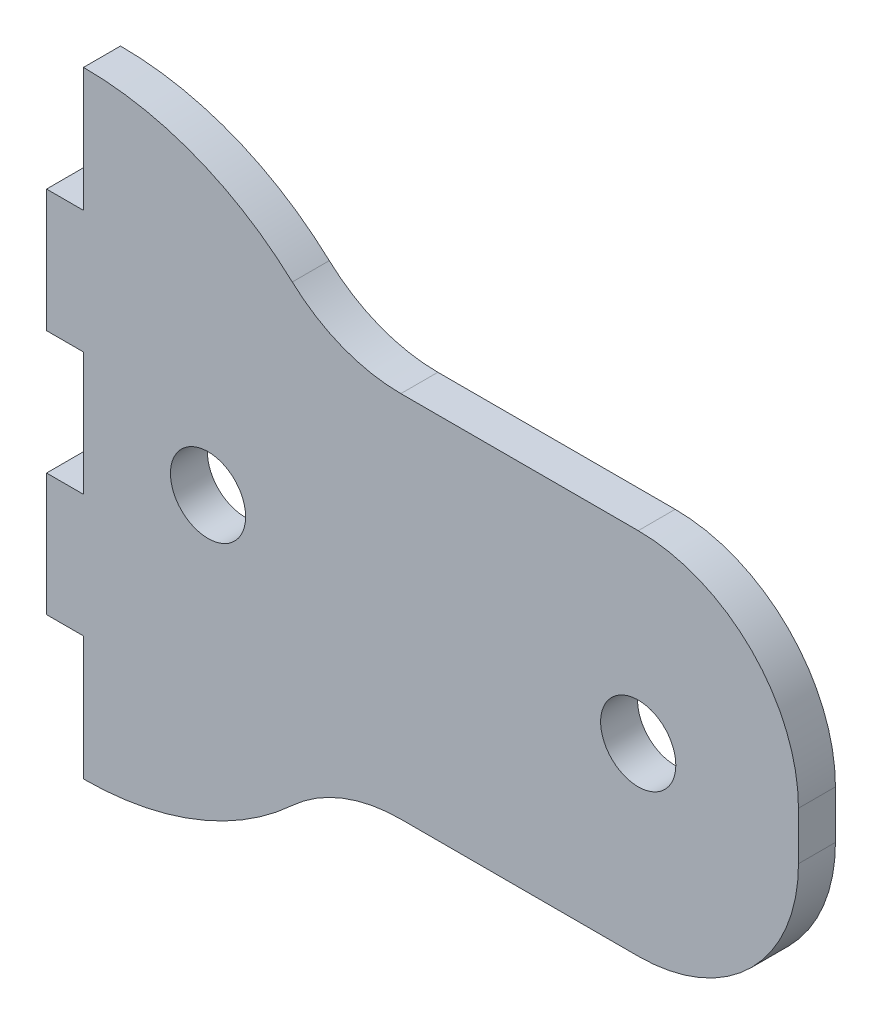
ISO-10303-21;
HEADER;
FILE_DESCRIPTION(('STEP AP214'),'2;1');
FILE_NAME('part.step','',(''),(''),'','','');
FILE_SCHEMA(('AUTOMOTIVE_DESIGN { 1 0 10303 214 1 1 1 1 }'));
ENDSEC;
DATA;
#1=APPLICATION_CONTEXT('core data for automotive mechanical design processes');
#2=APPLICATION_PROTOCOL_DEFINITION('international standard','automotive_design',2000,#1);
#3=PRODUCT_CONTEXT('',#1,'mechanical');
#4=PRODUCT('Part','Part','',(#3));
#5=PRODUCT_RELATED_PRODUCT_CATEGORY('part','',(#4));
#6=PRODUCT_DEFINITION_FORMATION('','',#4);
#7=PRODUCT_DEFINITION_CONTEXT('part definition',#1,'design');
#8=PRODUCT_DEFINITION('design','',#6,#7);
#9=PRODUCT_DEFINITION_SHAPE('','',#8);
#10=(LENGTH_UNIT() NAMED_UNIT(*) SI_UNIT(.MILLI.,.METRE.));
#11=(NAMED_UNIT(*) PLANE_ANGLE_UNIT() SI_UNIT($,.RADIAN.));
#12=(NAMED_UNIT(*) SI_UNIT($,.STERADIAN.) SOLID_ANGLE_UNIT());
#13=UNCERTAINTY_MEASURE_WITH_UNIT(LENGTH_MEASURE(1.E-05),#10,'distance_accuracy_value','');
#14=(GEOMETRIC_REPRESENTATION_CONTEXT(3) GLOBAL_UNCERTAINTY_ASSIGNED_CONTEXT((#13)) GLOBAL_UNIT_ASSIGNED_CONTEXT((#10,
#11,#12)) REPRESENTATION_CONTEXT('',''));
#15=CARTESIAN_POINT('',(0.,0.,0.));
#16=DIRECTION('',(0.,0.,1.));
#17=DIRECTION('',(1.,0.,0.));
#18=AXIS2_PLACEMENT_3D('',#15,#16,#17);
#19=CARTESIAN_POINT('',(0.,5.,3.));
#20=DIRECTION('',(1.,0.,0.));
#21=DIRECTION('',(0.,0.,-1.));
#22=AXIS2_PLACEMENT_3D('',#19,#20,#21);
#23=PLANE('',#22);
#24=DIRECTION('',(0.,-1.,0.));
#25=VECTOR('',#24,1.);
#26=CARTESIAN_POINT('',(0.,5.,0.));
#27=LINE('',#26,#25);
#28=CARTESIAN_POINT('',(0.,5.,0.));
#29=VERTEX_POINT('',#28);
#30=CARTESIAN_POINT('',(0.,-5.00000000000002,0.));
#31=VERTEX_POINT('',#30);
#32=EDGE_CURVE('E191',#29,#31,#27,.T.);
#33=ORIENTED_EDGE('',*,*,#32,.T.);
#34=DIRECTION('',(0.,0.,-1.));
#35=VECTOR('',#34,1.);
#36=CARTESIAN_POINT('',(0.,-5.00000000000002,3.));
#37=LINE('',#36,#35);
#38=CARTESIAN_POINT('',(0.,-5.00000000000002,3.));
#39=VERTEX_POINT('',#38);
#40=EDGE_CURVE('E11',#39,#31,#37,.T.);
#41=ORIENTED_EDGE('',*,*,#40,.F.);
#42=DIRECTION('',(0.,-1.,0.));
#43=VECTOR('',#42,1.);
#44=CARTESIAN_POINT('',(0.,5.,3.));
#45=LINE('',#44,#43);
#46=CARTESIAN_POINT('',(0.,5.,3.));
#47=VERTEX_POINT('',#46);
#48=EDGE_CURVE('E226',#47,#39,#45,.T.);
#49=ORIENTED_EDGE('',*,*,#48,.F.);
#50=DIRECTION('',(0.,0.,-1.));
#51=VECTOR('',#50,1.);
#52=CARTESIAN_POINT('',(0.,5.,3.));
#53=LINE('',#52,#51);
#54=EDGE_CURVE('E187',#47,#29,#53,.T.);
#55=ORIENTED_EDGE('',*,*,#54,.T.);
#56=EDGE_LOOP('',(#33,#41,#49,#55));
#57=FACE_BOUND('',#56,.T.);
#58=ADVANCED_FACE('F35',(#57),#23,.F.);
#59=CARTESIAN_POINT('',(-3.00000000000001,-5.00000000000002,3.));
#60=DIRECTION('',(0.,-1.,0.));
#61=DIRECTION('',(0.,0.,-1.));
#62=AXIS2_PLACEMENT_3D('',#59,#60,#61);
#63=PLANE('',#62);
#64=DIRECTION('',(-1.,0.,0.));
#65=VECTOR('',#64,1.);
#66=CARTESIAN_POINT('',(-3.00000000000001,-5.00000000000002,0.));
#67=LINE('',#66,#65);
#68=CARTESIAN_POINT('',(-3.00000000000001,-5.00000000000002,0.));
#69=VERTEX_POINT('',#68);
#70=EDGE_CURVE('E194',#31,#69,#67,.T.);
#71=ORIENTED_EDGE('',*,*,#70,.T.);
#72=DIRECTION('',(0.,0.,-1.));
#73=VECTOR('',#72,1.);
#74=CARTESIAN_POINT('',(-3.00000000000001,-5.00000000000002,3.));
#75=LINE('',#74,#73);
#76=CARTESIAN_POINT('',(-3.00000000000001,-5.00000000000002,3.));
#77=VERTEX_POINT('',#76);
#78=EDGE_CURVE('E43',#77,#69,#75,.T.);
#79=ORIENTED_EDGE('',*,*,#78,.F.);
#80=DIRECTION('',(-1.,0.,0.));
#81=VECTOR('',#80,1.);
#82=CARTESIAN_POINT('',(-3.00000000000001,-5.00000000000002,3.));
#83=LINE('',#82,#81);
#84=EDGE_CURVE('E124',#39,#77,#83,.T.);
#85=ORIENTED_EDGE('',*,*,#84,.F.);
#86=ORIENTED_EDGE('',*,*,#40,.T.);
#87=EDGE_LOOP('',(#71,#79,#85,#86));
#88=FACE_BOUND('',#87,.T.);
#89=ADVANCED_FACE('F335',(#88),#63,.F.);
#90=CARTESIAN_POINT('',(-3.,-14.95,3.));
#91=DIRECTION('',(1.,0.,0.));
#92=DIRECTION('',(0.,1.,0.));
#93=AXIS2_PLACEMENT_3D('',#90,#91,#92);
#94=PLANE('',#93);
#95=DIRECTION('',(0.,-1.,0.));
#96=VECTOR('',#95,1.);
#97=CARTESIAN_POINT('',(-3.,-14.95,0.));
#98=LINE('',#97,#96);
#99=CARTESIAN_POINT('',(-3.,-14.95,0.));
#100=VERTEX_POINT('',#99);
#101=EDGE_CURVE('E197',#69,#100,#98,.T.);
#102=ORIENTED_EDGE('',*,*,#101,.T.);
#103=DIRECTION('',(0.,0.,-1.));
#104=VECTOR('',#103,1.);
#105=CARTESIAN_POINT('',(-3.,-14.95,3.));
#106=LINE('',#105,#104);
#107=CARTESIAN_POINT('',(-3.,-14.95,3.));
#108=VERTEX_POINT('',#107);
#109=EDGE_CURVE('E263',#108,#100,#106,.T.);
#110=ORIENTED_EDGE('',*,*,#109,.F.);
#111=DIRECTION('',(0.,-1.,0.));
#112=VECTOR('',#111,1.);
#113=CARTESIAN_POINT('',(-3.,-14.95,3.));
#114=LINE('',#113,#112);
#115=EDGE_CURVE('E271',#77,#108,#114,.T.);
#116=ORIENTED_EDGE('',*,*,#115,.F.);
#117=ORIENTED_EDGE('',*,*,#78,.T.);
#118=EDGE_LOOP('',(#102,#110,#116,#117));
#119=FACE_BOUND('',#118,.T.);
#120=ADVANCED_FACE('F269',(#119),#94,.F.);
#121=CARTESIAN_POINT('',(0.,-14.95,3.));
#122=DIRECTION('',(0.,1.,0.));
#123=DIRECTION('',(0.,0.,1.));
#124=AXIS2_PLACEMENT_3D('',#121,#122,#123);
#125=PLANE('',#124);
#126=DIRECTION('',(1.,0.,0.));
#127=VECTOR('',#126,1.);
#128=CARTESIAN_POINT('',(0.,-14.95,0.));
#129=LINE('',#128,#127);
#130=CARTESIAN_POINT('',(0.,-14.95,0.));
#131=VERTEX_POINT('',#130);
#132=EDGE_CURVE('E199',#100,#131,#129,.T.);
#133=ORIENTED_EDGE('',*,*,#132,.T.);
#134=DIRECTION('',(0.,0.,-1.));
#135=VECTOR('',#134,1.);
#136=CARTESIAN_POINT('',(0.,-14.95,3.));
#137=LINE('',#136,#135);
#138=CARTESIAN_POINT('',(0.,-14.95,3.));
#139=VERTEX_POINT('',#138);
#140=EDGE_CURVE('E260',#139,#131,#137,.T.);
#141=ORIENTED_EDGE('',*,*,#140,.F.);
#142=DIRECTION('',(1.,0.,0.));
#143=VECTOR('',#142,1.);
#144=CARTESIAN_POINT('',(0.,-14.95,3.));
#145=LINE('',#144,#143);
#146=EDGE_CURVE('E289',#108,#139,#145,.T.);
#147=ORIENTED_EDGE('',*,*,#146,.F.);
#148=ORIENTED_EDGE('',*,*,#109,.T.);
#149=EDGE_LOOP('',(#133,#141,#147,#148));
#150=FACE_BOUND('',#149,.T.);
#151=ADVANCED_FACE('F280',(#150),#125,.F.);
#152=CARTESIAN_POINT('',(0.,-25.,3.));
#153=DIRECTION('',(1.,0.,0.));
#154=DIRECTION('',(0.,1.,0.));
#155=AXIS2_PLACEMENT_3D('',#152,#153,#154);
#156=PLANE('',#155);
#157=DIRECTION('',(0.,-1.,0.));
#158=VECTOR('',#157,1.);
#159=CARTESIAN_POINT('',(0.,-25.,0.));
#160=LINE('',#159,#158);
#161=CARTESIAN_POINT('',(0.,-25.,0.));
#162=VERTEX_POINT('',#161);
#163=EDGE_CURVE('E201',#131,#162,#160,.T.);
#164=ORIENTED_EDGE('',*,*,#163,.T.);
#165=DIRECTION('',(0.,0.,-1.));
#166=VECTOR('',#165,1.);
#167=CARTESIAN_POINT('',(0.,-25.,3.));
#168=LINE('',#167,#166);
#169=CARTESIAN_POINT('',(0.,-25.,3.));
#170=VERTEX_POINT('',#169);
#171=EDGE_CURVE('E257',#170,#162,#168,.T.);
#172=ORIENTED_EDGE('',*,*,#171,.F.);
#173=DIRECTION('',(0.,-1.,0.));
#174=VECTOR('',#173,1.);
#175=CARTESIAN_POINT('',(0.,-25.,3.));
#176=LINE('',#175,#174);
#177=EDGE_CURVE('E286',#139,#170,#176,.T.);
#178=ORIENTED_EDGE('',*,*,#177,.F.);
#179=ORIENTED_EDGE('',*,*,#140,.T.);
#180=EDGE_LOOP('',(#164,#172,#178,#179));
#181=FACE_BOUND('',#180,.T.);
#182=ADVANCED_FACE('F284',(#181),#156,.F.);
#183=CARTESIAN_POINT('',(0.,0.,3.));
#184=DIRECTION('',(0.,0.,-1.));
#185=DIRECTION('',(-1.,0.,0.));
#186=AXIS2_PLACEMENT_3D('',#183,#184,#185);
#187=CYLINDRICAL_SURFACE('',#186,25.);
#188=CARTESIAN_POINT('',(0.,0.,0.));
#189=DIRECTION('',(0.,0.,1.));
#190=DIRECTION('',(1.,0.,0.));
#191=AXIS2_PLACEMENT_3D('',#188,#189,#190);
#192=CIRCLE('',#191,25.);
#193=CARTESIAN_POINT('',(16.9374038517781,-18.3881578947368,0.));
#194=VERTEX_POINT('',#193);
#195=EDGE_CURVE('E203',#162,#194,#192,.T.);
#196=ORIENTED_EDGE('',*,*,#195,.T.);
#197=DIRECTION('',(0.,0.,-1.));
#198=VECTOR('',#197,1.);
#199=CARTESIAN_POINT('',(16.9374038517781,-18.3881578947368,3.));
#200=LINE('',#199,#198);
#201=CARTESIAN_POINT('',(16.9374038517781,-18.3881578947368,3.));
#202=VERTEX_POINT('',#201);
#203=EDGE_CURVE('E254',#202,#194,#200,.T.);
#204=ORIENTED_EDGE('',*,*,#203,.F.);
#205=CARTESIAN_POINT('',(0.,0.,3.));
#206=DIRECTION('',(0.,0.,1.));
#207=DIRECTION('',(1.,0.,0.));
#208=AXIS2_PLACEMENT_3D('',#205,#206,#207);
#209=CIRCLE('',#208,25.);
#210=EDGE_CURVE('E288',#170,#202,#209,.T.);
#211=ORIENTED_EDGE('',*,*,#210,.F.);
#212=ORIENTED_EDGE('',*,*,#171,.T.);
#213=EDGE_LOOP('',(#196,#204,#211,#212));
#214=FACE_BOUND('',#213,.T.);
#215=ADVANCED_FACE('F348',(#214),#187,.T.);
#216=CARTESIAN_POINT('',(25.7448538547028,-27.95,3.));
#217=DIRECTION('',(0.,0.,-1.));
#218=DIRECTION('',(-1.,0.,0.));
#219=AXIS2_PLACEMENT_3D('',#216,#217,#218);
#220=CYLINDRICAL_SURFACE('',#219,13.);
#221=CARTESIAN_POINT('',(25.7448538547028,-27.95,0.));
#222=DIRECTION('',(0.,0.,-1.));
#223=DIRECTION('',(1.,0.,0.));
#224=AXIS2_PLACEMENT_3D('',#221,#222,#223);
#225=CIRCLE('',#224,13.);
#226=CARTESIAN_POINT('',(25.7448538547027,-14.95,0.));
#227=VERTEX_POINT('',#226);
#228=EDGE_CURVE('E205',#194,#227,#225,.T.);
#229=ORIENTED_EDGE('',*,*,#228,.T.);
#230=DIRECTION('',(0.,0.,-1.));
#231=VECTOR('',#230,1.);
#232=CARTESIAN_POINT('',(25.7448538547027,-14.95,3.));
#233=LINE('',#232,#231);
#234=CARTESIAN_POINT('',(25.7448538547027,-14.95,3.));
#235=VERTEX_POINT('',#234);
#236=EDGE_CURVE('E251',#235,#227,#233,.T.);
#237=ORIENTED_EDGE('',*,*,#236,.F.);
#238=CARTESIAN_POINT('',(25.7448538547028,-27.95,3.));
#239=DIRECTION('',(0.,0.,-1.));
#240=DIRECTION('',(1.,0.,0.));
#241=AXIS2_PLACEMENT_3D('',#238,#239,#240);
#242=CIRCLE('',#241,13.);
#243=EDGE_CURVE('E291',#202,#235,#242,.T.);
#244=ORIENTED_EDGE('',*,*,#243,.F.);
#245=ORIENTED_EDGE('',*,*,#203,.T.);
#246=EDGE_LOOP('',(#229,#237,#244,#245));
#247=FACE_BOUND('',#246,.T.);
#248=ADVANCED_FACE('F351',(#247),#220,.F.);
#249=CARTESIAN_POINT('',(44.9999999999999,-14.9499999999999,3.));
#250=DIRECTION('',(0.,1.,0.));
#251=DIRECTION('',(-1.,0.,0.));
#252=AXIS2_PLACEMENT_3D('',#249,#250,#251);
#253=PLANE('',#252);
#254=DIRECTION('',(1.,0.,0.));
#255=VECTOR('',#254,1.);
#256=CARTESIAN_POINT('',(44.9999999999999,-14.9499999999999,0.));
#257=LINE('',#256,#255);
#258=CARTESIAN_POINT('',(44.9999999999999,-14.9499999999999,0.));
#259=VERTEX_POINT('',#258);
#260=EDGE_CURVE('E207',#227,#259,#257,.T.);
#261=ORIENTED_EDGE('',*,*,#260,.T.);
#262=DIRECTION('',(0.,0.,-1.));
#263=VECTOR('',#262,1.);
#264=CARTESIAN_POINT('',(44.9999999999999,-14.9499999999999,3.));
#265=LINE('',#264,#263);
#266=CARTESIAN_POINT('',(44.9999999999999,-14.9499999999999,3.));
#267=VERTEX_POINT('',#266);
#268=EDGE_CURVE('E248',#267,#259,#265,.T.);
#269=ORIENTED_EDGE('',*,*,#268,.F.);
#270=DIRECTION('',(1.,0.,0.));
#271=VECTOR('',#270,1.);
#272=CARTESIAN_POINT('',(44.9999999999999,-14.9499999999999,3.));
#273=LINE('',#272,#271);
#274=EDGE_CURVE('E297',#235,#267,#273,.T.);
#275=ORIENTED_EDGE('',*,*,#274,.F.);
#276=ORIENTED_EDGE('',*,*,#236,.T.);
#277=EDGE_LOOP('',(#261,#269,#275,#276));
#278=FACE_BOUND('',#277,.T.);
#279=ADVANCED_FACE('F355',(#278),#253,.F.);
#280=CARTESIAN_POINT('',(45.,-1.94999999999994,3.));
#281=DIRECTION('',(0.,0.,-1.));
#282=DIRECTION('',(-1.,0.,0.));
#283=AXIS2_PLACEMENT_3D('',#280,#281,#282);
#284=CYLINDRICAL_SURFACE('',#283,13.);
#285=CARTESIAN_POINT('',(45.,-1.94999999999994,0.));
#286=DIRECTION('',(0.,0.,1.));
#287=DIRECTION('',(-1.,0.,0.));
#288=AXIS2_PLACEMENT_3D('',#285,#286,#287);
#289=CIRCLE('',#288,13.);
#290=CARTESIAN_POINT('',(58.,-1.94999999999985,0.));
#291=VERTEX_POINT('',#290);
#292=EDGE_CURVE('E209',#259,#291,#289,.T.);
#293=ORIENTED_EDGE('',*,*,#292,.T.);
#294=DIRECTION('',(0.,0.,-1.));
#295=VECTOR('',#294,1.);
#296=CARTESIAN_POINT('',(58.,-1.94999999999985,3.));
#297=LINE('',#296,#295);
#298=CARTESIAN_POINT('',(58.,-1.94999999999985,3.));
#299=VERTEX_POINT('',#298);
#300=EDGE_CURVE('E245',#299,#291,#297,.T.);
#301=ORIENTED_EDGE('',*,*,#300,.F.);
#302=CARTESIAN_POINT('',(45.,-1.94999999999994,3.));
#303=DIRECTION('',(0.,0.,1.));
#304=DIRECTION('',(-1.,0.,0.));
#305=AXIS2_PLACEMENT_3D('',#302,#303,#304);
#306=CIRCLE('',#305,13.);
#307=EDGE_CURVE('E299',#267,#299,#306,.T.);
#308=ORIENTED_EDGE('',*,*,#307,.F.);
#309=ORIENTED_EDGE('',*,*,#268,.T.);
#310=EDGE_LOOP('',(#293,#301,#308,#309));
#311=FACE_BOUND('',#310,.T.);
#312=ADVANCED_FACE('F359',(#311),#284,.T.);
#313=CARTESIAN_POINT('',(58.,1.94999999999991,3.));
#314=DIRECTION('',(-1.,0.,0.));
#315=DIRECTION('',(0.,0.,1.));
#316=AXIS2_PLACEMENT_3D('',#313,#314,#315);
#317=PLANE('',#316);
#318=DIRECTION('',(0.,1.,0.));
#319=VECTOR('',#318,1.);
#320=CARTESIAN_POINT('',(58.,1.94999999999991,0.));
#321=LINE('',#320,#319);
#322=CARTESIAN_POINT('',(58.,1.94999999999991,0.));
#323=VERTEX_POINT('',#322);
#324=EDGE_CURVE('E211',#291,#323,#321,.T.);
#325=ORIENTED_EDGE('',*,*,#324,.T.);
#326=DIRECTION('',(0.,0.,-1.));
#327=VECTOR('',#326,1.);
#328=CARTESIAN_POINT('',(58.,1.94999999999991,3.));
#329=LINE('',#328,#327);
#330=CARTESIAN_POINT('',(58.,1.94999999999991,3.));
#331=VERTEX_POINT('',#330);
#332=EDGE_CURVE('E242',#331,#323,#329,.T.);
#333=ORIENTED_EDGE('',*,*,#332,.F.);
#334=DIRECTION('',(0.,1.,0.));
#335=VECTOR('',#334,1.);
#336=CARTESIAN_POINT('',(58.,1.94999999999991,3.));
#337=LINE('',#336,#335);
#338=EDGE_CURVE('E301',#299,#331,#337,.T.);
#339=ORIENTED_EDGE('',*,*,#338,.F.);
#340=ORIENTED_EDGE('',*,*,#300,.T.);
#341=EDGE_LOOP('',(#325,#333,#339,#340));
#342=FACE_BOUND('',#341,.T.);
#343=ADVANCED_FACE('F363',(#342),#317,.F.);
#344=CARTESIAN_POINT('',(45.,1.95,3.));
#345=DIRECTION('',(0.,0.,-1.));
#346=DIRECTION('',(-1.,0.,0.));
#347=AXIS2_PLACEMENT_3D('',#344,#345,#346);
#348=CYLINDRICAL_SURFACE('',#347,13.);
#349=CARTESIAN_POINT('',(45.,1.95,0.));
#350=DIRECTION('',(0.,0.,1.));
#351=DIRECTION('',(-1.,0.,0.));
#352=AXIS2_PLACEMENT_3D('',#349,#350,#351);
#353=CIRCLE('',#352,13.);
#354=CARTESIAN_POINT('',(44.9999999999999,14.95,0.));
#355=VERTEX_POINT('',#354);
#356=EDGE_CURVE('E213',#323,#355,#353,.T.);
#357=ORIENTED_EDGE('',*,*,#356,.T.);
#358=DIRECTION('',(0.,0.,-1.));
#359=VECTOR('',#358,1.);
#360=CARTESIAN_POINT('',(44.9999999999999,14.95,3.));
#361=LINE('',#360,#359);
#362=CARTESIAN_POINT('',(44.9999999999999,14.95,3.));
#363=VERTEX_POINT('',#362);
#364=EDGE_CURVE('E239',#363,#355,#361,.T.);
#365=ORIENTED_EDGE('',*,*,#364,.F.);
#366=CARTESIAN_POINT('',(45.,1.95,3.));
#367=DIRECTION('',(0.,0.,1.));
#368=DIRECTION('',(-1.,0.,0.));
#369=AXIS2_PLACEMENT_3D('',#366,#367,#368);
#370=CIRCLE('',#369,13.);
#371=EDGE_CURVE('E303',#331,#363,#370,.T.);
#372=ORIENTED_EDGE('',*,*,#371,.F.);
#373=ORIENTED_EDGE('',*,*,#332,.T.);
#374=EDGE_LOOP('',(#357,#365,#372,#373));
#375=FACE_BOUND('',#374,.T.);
#376=ADVANCED_FACE('F367',(#375),#348,.T.);
#377=CARTESIAN_POINT('',(25.7448538547027,14.95,3.));
#378=DIRECTION('',(0.,-1.,0.));
#379=DIRECTION('',(0.,0.,-1.));
#380=AXIS2_PLACEMENT_3D('',#377,#378,#379);
#381=PLANE('',#380);
#382=DIRECTION('',(-1.,0.,0.));
#383=VECTOR('',#382,1.);
#384=CARTESIAN_POINT('',(25.7448538547027,14.95,0.));
#385=LINE('',#384,#383);
#386=CARTESIAN_POINT('',(25.7448538547027,14.95,0.));
#387=VERTEX_POINT('',#386);
#388=EDGE_CURVE('E215',#355,#387,#385,.T.);
#389=ORIENTED_EDGE('',*,*,#388,.T.);
#390=DIRECTION('',(0.,0.,-1.));
#391=VECTOR('',#390,1.);
#392=CARTESIAN_POINT('',(25.7448538547027,14.95,3.));
#393=LINE('',#392,#391);
#394=CARTESIAN_POINT('',(25.7448538547027,14.95,3.));
#395=VERTEX_POINT('',#394);
#396=EDGE_CURVE('E236',#395,#387,#393,.T.);
#397=ORIENTED_EDGE('',*,*,#396,.F.);
#398=DIRECTION('',(-1.,0.,0.));
#399=VECTOR('',#398,1.);
#400=CARTESIAN_POINT('',(25.7448538547027,14.95,3.));
#401=LINE('',#400,#399);
#402=EDGE_CURVE('E305',#363,#395,#401,.T.);
#403=ORIENTED_EDGE('',*,*,#402,.F.);
#404=ORIENTED_EDGE('',*,*,#364,.T.);
#405=EDGE_LOOP('',(#389,#397,#403,#404));
#406=FACE_BOUND('',#405,.T.);
#407=ADVANCED_FACE('F371',(#406),#381,.F.);
#408=CARTESIAN_POINT('',(25.7448538547027,27.95,3.));
#409=DIRECTION('',(0.,0.,-1.));
#410=DIRECTION('',(-1.,0.,0.));
#411=AXIS2_PLACEMENT_3D('',#408,#409,#410);
#412=CYLINDRICAL_SURFACE('',#411,13.);
#413=CARTESIAN_POINT('',(25.7448538547027,27.95,0.));
#414=DIRECTION('',(0.,0.,-1.));
#415=DIRECTION('',(-1.,0.,0.));
#416=AXIS2_PLACEMENT_3D('',#413,#414,#415);
#417=CIRCLE('',#416,13.);
#418=CARTESIAN_POINT('',(16.9374038517781,18.3881578947368,0.));
#419=VERTEX_POINT('',#418);
#420=EDGE_CURVE('E217',#387,#419,#417,.T.);
#421=ORIENTED_EDGE('',*,*,#420,.T.);
#422=DIRECTION('',(0.,0.,-1.));
#423=VECTOR('',#422,1.);
#424=CARTESIAN_POINT('',(16.9374038517781,18.3881578947368,3.));
#425=LINE('',#424,#423);
#426=CARTESIAN_POINT('',(16.9374038517781,18.3881578947368,3.));
#427=VERTEX_POINT('',#426);
#428=EDGE_CURVE('E233',#427,#419,#425,.T.);
#429=ORIENTED_EDGE('',*,*,#428,.F.);
#430=CARTESIAN_POINT('',(25.7448538547027,27.95,3.));
#431=DIRECTION('',(0.,0.,-1.));
#432=DIRECTION('',(-1.,0.,0.));
#433=AXIS2_PLACEMENT_3D('',#430,#431,#432);
#434=CIRCLE('',#433,13.);
#435=EDGE_CURVE('E307',#395,#427,#434,.T.);
#436=ORIENTED_EDGE('',*,*,#435,.F.);
#437=ORIENTED_EDGE('',*,*,#396,.T.);
#438=EDGE_LOOP('',(#421,#429,#436,#437));
#439=FACE_BOUND('',#438,.T.);
#440=ADVANCED_FACE('F375',(#439),#412,.F.);
#441=CARTESIAN_POINT('',(0.,0.,3.));
#442=DIRECTION('',(0.,0.,-1.));
#443=DIRECTION('',(-1.,0.,0.));
#444=AXIS2_PLACEMENT_3D('',#441,#442,#443);
#445=CYLINDRICAL_SURFACE('',#444,25.);
#446=CARTESIAN_POINT('',(0.,0.,0.));
#447=DIRECTION('',(0.,0.,1.));
#448=DIRECTION('',(1.,0.,0.));
#449=AXIS2_PLACEMENT_3D('',#446,#447,#448);
#450=CIRCLE('',#449,25.);
#451=CARTESIAN_POINT('',(0.,25.,0.));
#452=VERTEX_POINT('',#451);
#453=EDGE_CURVE('E219',#419,#452,#450,.T.);
#454=ORIENTED_EDGE('',*,*,#453,.T.);
#455=DIRECTION('',(0.,0.,-1.));
#456=VECTOR('',#455,1.);
#457=CARTESIAN_POINT('',(0.,25.,3.));
#458=LINE('',#457,#456);
#459=CARTESIAN_POINT('',(0.,25.,3.));
#460=VERTEX_POINT('',#459);
#461=EDGE_CURVE('E230',#460,#452,#458,.T.);
#462=ORIENTED_EDGE('',*,*,#461,.F.);
#463=CARTESIAN_POINT('',(0.,0.,3.));
#464=DIRECTION('',(0.,0.,1.));
#465=DIRECTION('',(1.,0.,0.));
#466=AXIS2_PLACEMENT_3D('',#463,#464,#465);
#467=CIRCLE('',#466,25.);
#468=EDGE_CURVE('E309',#427,#460,#467,.T.);
#469=ORIENTED_EDGE('',*,*,#468,.F.);
#470=ORIENTED_EDGE('',*,*,#428,.T.);
#471=EDGE_LOOP('',(#454,#462,#469,#470));
#472=FACE_BOUND('',#471,.T.);
#473=ADVANCED_FACE('F315',(#472),#445,.T.);
#474=CARTESIAN_POINT('',(0.,25.,3.));
#475=DIRECTION('',(1.,0.,0.));
#476=DIRECTION('',(0.,1.,0.));
#477=AXIS2_PLACEMENT_3D('',#474,#475,#476);
#478=PLANE('',#477);
#479=DIRECTION('',(0.,-1.,0.));
#480=VECTOR('',#479,1.);
#481=CARTESIAN_POINT('',(0.,25.,0.));
#482=LINE('',#481,#480);
#483=CARTESIAN_POINT('',(0.,14.95,0.));
#484=VERTEX_POINT('',#483);
#485=EDGE_CURVE('E221',#452,#484,#482,.T.);
#486=ORIENTED_EDGE('',*,*,#485,.T.);
#487=DIRECTION('',(0.,0.,-1.));
#488=VECTOR('',#487,1.);
#489=CARTESIAN_POINT('',(0.,14.95,3.));
#490=LINE('',#489,#488);
#491=CARTESIAN_POINT('',(0.,14.95,3.));
#492=VERTEX_POINT('',#491);
#493=EDGE_CURVE('E182',#492,#484,#490,.T.);
#494=ORIENTED_EDGE('',*,*,#493,.F.);
#495=DIRECTION('',(0.,-1.,0.));
#496=VECTOR('',#495,1.);
#497=CARTESIAN_POINT('',(0.,25.,3.));
#498=LINE('',#497,#496);
#499=EDGE_CURVE('E173',#460,#492,#498,.T.);
#500=ORIENTED_EDGE('',*,*,#499,.F.);
#501=ORIENTED_EDGE('',*,*,#461,.T.);
#502=EDGE_LOOP('',(#486,#494,#500,#501));
#503=FACE_BOUND('',#502,.T.);
#504=ADVANCED_FACE('F319',(#503),#478,.F.);
#505=CARTESIAN_POINT('',(0.,14.95,3.));
#506=DIRECTION('',(0.,-1.,0.));
#507=DIRECTION('',(0.,0.,-1.));
#508=AXIS2_PLACEMENT_3D('',#505,#506,#507);
#509=PLANE('',#508);
#510=DIRECTION('',(-1.,0.,0.));
#511=VECTOR('',#510,1.);
#512=CARTESIAN_POINT('',(0.,14.95,0.));
#513=LINE('',#512,#511);
#514=CARTESIAN_POINT('',(-3.,14.95,0.));
#515=VERTEX_POINT('',#514);
#516=EDGE_CURVE('E181',#484,#515,#513,.T.);
#517=ORIENTED_EDGE('',*,*,#516,.T.);
#518=DIRECTION('',(0.,0.,-1.));
#519=VECTOR('',#518,1.);
#520=CARTESIAN_POINT('',(-3.,14.95,3.));
#521=LINE('',#520,#519);
#522=CARTESIAN_POINT('',(-3.,14.95,3.));
#523=VERTEX_POINT('',#522);
#524=EDGE_CURVE('E178',#523,#515,#521,.T.);
#525=ORIENTED_EDGE('',*,*,#524,.F.);
#526=DIRECTION('',(-1.,0.,0.));
#527=VECTOR('',#526,1.);
#528=CARTESIAN_POINT('',(0.,14.95,3.));
#529=LINE('',#528,#527);
#530=EDGE_CURVE('E167',#492,#523,#529,.T.);
#531=ORIENTED_EDGE('',*,*,#530,.F.);
#532=ORIENTED_EDGE('',*,*,#493,.T.);
#533=EDGE_LOOP('',(#517,#525,#531,#532));
#534=FACE_BOUND('',#533,.T.);
#535=ADVANCED_FACE('F179',(#534),#509,.F.);
#536=CARTESIAN_POINT('',(-3.,14.95,3.));
#537=DIRECTION('',(1.,0.,0.));
#538=DIRECTION('',(0.,1.,0.));
#539=AXIS2_PLACEMENT_3D('',#536,#537,#538);
#540=PLANE('',#539);
#541=DIRECTION('',(0.,-1.,0.));
#542=VECTOR('',#541,1.);
#543=CARTESIAN_POINT('',(-3.,14.95,0.));
#544=LINE('',#543,#542);
#545=CARTESIAN_POINT('',(-3.00000000000001,5.,0.));
#546=VERTEX_POINT('',#545);
#547=EDGE_CURVE('E110',#515,#546,#544,.T.);
#548=ORIENTED_EDGE('',*,*,#547,.T.);
#549=DIRECTION('',(0.,0.,-1.));
#550=VECTOR('',#549,1.);
#551=CARTESIAN_POINT('',(-3.00000000000001,5.,3.));
#552=LINE('',#551,#550);
#553=CARTESIAN_POINT('',(-3.00000000000001,5.,3.));
#554=VERTEX_POINT('',#553);
#555=EDGE_CURVE('E183',#554,#546,#552,.T.);
#556=ORIENTED_EDGE('',*,*,#555,.F.);
#557=DIRECTION('',(0.,-1.,0.));
#558=VECTOR('',#557,1.);
#559=CARTESIAN_POINT('',(-3.,14.95,3.));
#560=LINE('',#559,#558);
#561=EDGE_CURVE('E171',#523,#554,#560,.T.);
#562=ORIENTED_EDGE('',*,*,#561,.F.);
#563=ORIENTED_EDGE('',*,*,#524,.T.);
#564=EDGE_LOOP('',(#548,#556,#562,#563));
#565=FACE_BOUND('',#564,.T.);
#566=ADVANCED_FACE('F185',(#565),#540,.F.);
#567=CARTESIAN_POINT('',(-3.00000000000001,5.,3.));
#568=DIRECTION('',(0.,1.,0.));
#569=DIRECTION('',(0.,0.,1.));
#570=AXIS2_PLACEMENT_3D('',#567,#568,#569);
#571=PLANE('',#570);
#572=DIRECTION('',(1.,0.,0.));
#573=VECTOR('',#572,1.);
#574=CARTESIAN_POINT('',(-3.00000000000001,5.,0.));
#575=LINE('',#574,#573);
#576=EDGE_CURVE('E116',#546,#29,#575,.T.);
#577=ORIENTED_EDGE('',*,*,#576,.T.);
#578=ORIENTED_EDGE('',*,*,#54,.F.);
#579=DIRECTION('',(1.,0.,0.));
#580=VECTOR('',#579,1.);
#581=CARTESIAN_POINT('',(-3.00000000000001,5.,3.));
#582=LINE('',#581,#580);
#583=EDGE_CURVE('E51',#554,#47,#582,.T.);
#584=ORIENTED_EDGE('',*,*,#583,.F.);
#585=ORIENTED_EDGE('',*,*,#555,.T.);
#586=EDGE_LOOP('',(#577,#578,#584,#585));
#587=FACE_BOUND('',#586,.T.);
#588=ADVANCED_FACE('F323',(#587),#571,.F.);
#589=CARTESIAN_POINT('',(0.,0.,3.));
#590=DIRECTION('',(0.,0.,1.));
#591=DIRECTION('',(1.,0.,0.));
#592=AXIS2_PLACEMENT_3D('',#589,#590,#591);
#593=PLANE('',#592);
#594=CARTESIAN_POINT('',(10.1,0.,3.));
#595=DIRECTION('',(0.,0.,1.));
#596=DIRECTION('',(1.,0.,0.));
#597=AXIS2_PLACEMENT_3D('',#594,#595,#596);
#598=CIRCLE('',#597,3.04999999999999);
#599=CARTESIAN_POINT('',(13.15,0.,3.));
#600=VERTEX_POINT('',#599);
#601=EDGE_CURVE('E438',#600,#600,#598,.T.);
#602=ORIENTED_EDGE('',*,*,#601,.F.);
#603=EDGE_LOOP('',(#602));
#604=FACE_BOUND('',#603,.T.);
#605=CARTESIAN_POINT('',(45.,0.,3.));
#606=DIRECTION('',(0.,0.,1.));
#607=DIRECTION('',(1.,0.,0.));
#608=AXIS2_PLACEMENT_3D('',#605,#606,#607);
#609=CIRCLE('',#608,3.04999999999999);
#610=CARTESIAN_POINT('',(48.05,0.,3.));
#611=VERTEX_POINT('',#610);
#612=EDGE_CURVE('E442',#611,#611,#609,.T.);
#613=ORIENTED_EDGE('',*,*,#612,.F.);
#614=EDGE_LOOP('',(#613));
#615=FACE_BOUND('',#614,.T.);
#616=ORIENTED_EDGE('',*,*,#48,.T.);
#617=ORIENTED_EDGE('',*,*,#84,.T.);
#618=ORIENTED_EDGE('',*,*,#115,.T.);
#619=ORIENTED_EDGE('',*,*,#146,.T.);
#620=ORIENTED_EDGE('',*,*,#177,.T.);
#621=ORIENTED_EDGE('',*,*,#210,.T.);
#622=ORIENTED_EDGE('',*,*,#243,.T.);
#623=ORIENTED_EDGE('',*,*,#274,.T.);
#624=ORIENTED_EDGE('',*,*,#307,.T.);
#625=ORIENTED_EDGE('',*,*,#338,.T.);
#626=ORIENTED_EDGE('',*,*,#371,.T.);
#627=ORIENTED_EDGE('',*,*,#402,.T.);
#628=ORIENTED_EDGE('',*,*,#435,.T.);
#629=ORIENTED_EDGE('',*,*,#468,.T.);
#630=ORIENTED_EDGE('',*,*,#499,.T.);
#631=ORIENTED_EDGE('',*,*,#530,.T.);
#632=ORIENTED_EDGE('',*,*,#561,.T.);
#633=ORIENTED_EDGE('',*,*,#583,.T.);
#634=EDGE_LOOP('',(#616,#617,#618,#619,#620,#621,#622,#623,#624,#625,#626,#627,#628,#629,#630,
#631,#632,#633));
#635=FACE_BOUND('',#634,.T.);
#636=ADVANCED_FACE('F169',(#604,#615,#635),#593,.T.);
#637=CARTESIAN_POINT('',(0.,0.,0.));
#638=DIRECTION('',(0.,0.,1.));
#639=DIRECTION('',(1.,0.,0.));
#640=AXIS2_PLACEMENT_3D('',#637,#638,#639);
#641=PLANE('',#640);
#642=CARTESIAN_POINT('',(10.1,0.,0.));
#643=DIRECTION('',(0.,0.,1.));
#644=DIRECTION('',(1.,0.,0.));
#645=AXIS2_PLACEMENT_3D('',#642,#643,#644);
#646=CIRCLE('',#645,3.04999999999999);
#647=CARTESIAN_POINT('',(13.15,0.,0.));
#648=VERTEX_POINT('',#647);
#649=EDGE_CURVE('E441',#648,#648,#646,.T.);
#650=ORIENTED_EDGE('',*,*,#649,.T.);
#651=EDGE_LOOP('',(#650));
#652=FACE_BOUND('',#651,.T.);
#653=CARTESIAN_POINT('',(45.,0.,0.));
#654=DIRECTION('',(0.,0.,1.));
#655=DIRECTION('',(1.,0.,0.));
#656=AXIS2_PLACEMENT_3D('',#653,#654,#655);
#657=CIRCLE('',#656,3.04999999999999);
#658=CARTESIAN_POINT('',(48.05,0.,0.));
#659=VERTEX_POINT('',#658);
#660=EDGE_CURVE('E195',#659,#659,#657,.T.);
#661=ORIENTED_EDGE('',*,*,#660,.T.);
#662=EDGE_LOOP('',(#661));
#663=FACE_BOUND('',#662,.T.);
#664=ORIENTED_EDGE('',*,*,#32,.F.);
#665=ORIENTED_EDGE('',*,*,#576,.F.);
#666=ORIENTED_EDGE('',*,*,#547,.F.);
#667=ORIENTED_EDGE('',*,*,#516,.F.);
#668=ORIENTED_EDGE('',*,*,#485,.F.);
#669=ORIENTED_EDGE('',*,*,#453,.F.);
#670=ORIENTED_EDGE('',*,*,#420,.F.);
#671=ORIENTED_EDGE('',*,*,#388,.F.);
#672=ORIENTED_EDGE('',*,*,#356,.F.);
#673=ORIENTED_EDGE('',*,*,#324,.F.);
#674=ORIENTED_EDGE('',*,*,#292,.F.);
#675=ORIENTED_EDGE('',*,*,#260,.F.);
#676=ORIENTED_EDGE('',*,*,#228,.F.);
#677=ORIENTED_EDGE('',*,*,#195,.F.);
#678=ORIENTED_EDGE('',*,*,#163,.F.);
#679=ORIENTED_EDGE('',*,*,#132,.F.);
#680=ORIENTED_EDGE('',*,*,#101,.F.);
#681=ORIENTED_EDGE('',*,*,#70,.F.);
#682=EDGE_LOOP('',(#664,#665,#666,#667,#668,#669,#670,#671,#672,#673,#674,#675,#676,#677,#678,
#679,#680,#681));
#683=FACE_BOUND('',#682,.T.);
#684=ADVANCED_FACE('F275',(#652,#663,#683),#641,.F.);
#685=CARTESIAN_POINT('',(45.,0.,3.));
#686=DIRECTION('',(0.,0.,1.));
#687=DIRECTION('',(1.,0.,0.));
#688=AXIS2_PLACEMENT_3D('',#685,#686,#687);
#689=CYLINDRICAL_SURFACE('',#688,3.04999999999999);
#690=ORIENTED_EDGE('',*,*,#612,.T.);
#691=EDGE_LOOP('',(#690));
#692=FACE_BOUND('',#691,.T.);
#693=ORIENTED_EDGE('',*,*,#660,.F.);
#694=EDGE_LOOP('',(#693));
#695=FACE_BOUND('',#694,.T.);
#696=ADVANCED_FACE('F412',(#692,#695),#689,.F.);
#697=CARTESIAN_POINT('',(10.1,0.,3.));
#698=DIRECTION('',(0.,0.,1.));
#699=DIRECTION('',(1.,0.,0.));
#700=AXIS2_PLACEMENT_3D('',#697,#698,#699);
#701=CYLINDRICAL_SURFACE('',#700,3.04999999999999);
#702=ORIENTED_EDGE('',*,*,#601,.T.);
#703=EDGE_LOOP('',(#702));
#704=FACE_BOUND('',#703,.T.);
#705=ORIENTED_EDGE('',*,*,#649,.F.);
#706=EDGE_LOOP('',(#705));
#707=FACE_BOUND('',#706,.T.);
#708=ADVANCED_FACE('F421',(#704,#707),#701,.F.);
#709=CLOSED_SHELL('',(#58,#89,#120,#151,#182,#215,#248,#279,#312,#343,#376,#407,#440,#473,#504,
#535,#566,#588,#636,#684,#696,#708));
#710=MANIFOLD_SOLID_BREP('B2',#709);
#711=ADVANCED_BREP_SHAPE_REPRESENTATION('',(#18,#710),#14);
#712=SHAPE_DEFINITION_REPRESENTATION(#9,#711);
ENDSEC;
END-ISO-10303-21;
